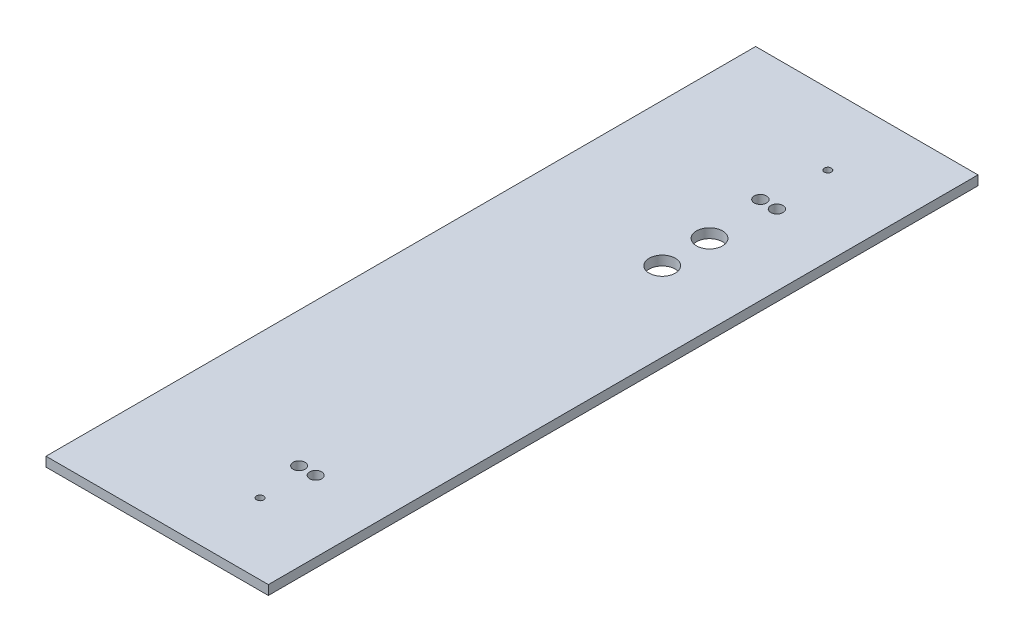
ISO-10303-21;
HEADER;
FILE_DESCRIPTION(('STEP AP214'),'2;1');
FILE_NAME('part.step','',(''),(''),'','','');
FILE_SCHEMA(('AUTOMOTIVE_DESIGN { 1 0 10303 214 1 1 1 1 }'));
ENDSEC;
DATA;
#1=APPLICATION_CONTEXT('core data for automotive mechanical design processes');
#2=APPLICATION_PROTOCOL_DEFINITION('international standard','automotive_design',2000,#1);
#3=PRODUCT_CONTEXT('',#1,'mechanical');
#4=PRODUCT('Part','Part','',(#3));
#5=PRODUCT_RELATED_PRODUCT_CATEGORY('part','',(#4));
#6=PRODUCT_DEFINITION_FORMATION('','',#4);
#7=PRODUCT_DEFINITION_CONTEXT('part definition',#1,'design');
#8=PRODUCT_DEFINITION('design','',#6,#7);
#9=PRODUCT_DEFINITION_SHAPE('','',#8);
#10=(LENGTH_UNIT() NAMED_UNIT(*) SI_UNIT(.MILLI.,.METRE.));
#11=(NAMED_UNIT(*) PLANE_ANGLE_UNIT() SI_UNIT($,.RADIAN.));
#12=(NAMED_UNIT(*) SI_UNIT($,.STERADIAN.) SOLID_ANGLE_UNIT());
#13=UNCERTAINTY_MEASURE_WITH_UNIT(LENGTH_MEASURE(1.E-05),#10,'distance_accuracy_value','');
#14=(GEOMETRIC_REPRESENTATION_CONTEXT(3) GLOBAL_UNCERTAINTY_ASSIGNED_CONTEXT((#13)) GLOBAL_UNIT_ASSIGNED_CONTEXT((#10,
#11,#12)) REPRESENTATION_CONTEXT('',''));
#15=CARTESIAN_POINT('',(0.,0.,0.));
#16=DIRECTION('',(0.,0.,1.));
#17=DIRECTION('',(1.,0.,0.));
#18=AXIS2_PLACEMENT_3D('',#15,#16,#17);
#19=CARTESIAN_POINT('',(0.,8.,0.));
#20=DIRECTION('',(1.,0.,0.));
#21=DIRECTION('',(0.,0.,-1.));
#22=AXIS2_PLACEMENT_3D('',#19,#20,#21);
#23=PLANE('',#22);
#24=DIRECTION('',(0.,0.,1.));
#25=VECTOR('',#24,1.);
#26=CARTESIAN_POINT('',(0.,0.,0.));
#27=LINE('',#26,#25);
#28=CARTESIAN_POINT('',(0.,0.,-600.));
#29=VERTEX_POINT('',#28);
#30=CARTESIAN_POINT('',(0.,0.,0.));
#31=VERTEX_POINT('',#30);
#32=EDGE_CURVE('E106',#29,#31,#27,.T.);
#33=ORIENTED_EDGE('',*,*,#32,.T.);
#34=DIRECTION('',(0.,-1.,0.));
#35=VECTOR('',#34,1.);
#36=CARTESIAN_POINT('',(0.,8.,0.));
#37=LINE('',#36,#35);
#38=CARTESIAN_POINT('',(0.,8.,0.));
#39=VERTEX_POINT('',#38);
#40=EDGE_CURVE('E11',#39,#31,#37,.T.);
#41=ORIENTED_EDGE('',*,*,#40,.F.);
#42=DIRECTION('',(0.,0.,1.));
#43=VECTOR('',#42,1.);
#44=CARTESIAN_POINT('',(0.,8.,0.));
#45=LINE('',#44,#43);
#46=CARTESIAN_POINT('',(0.,8.,-600.));
#47=VERTEX_POINT('',#46);
#48=EDGE_CURVE('E90',#47,#39,#45,.T.);
#49=ORIENTED_EDGE('',*,*,#48,.F.);
#50=DIRECTION('',(0.,-1.,0.));
#51=VECTOR('',#50,1.);
#52=CARTESIAN_POINT('',(0.,8.,-600.));
#53=LINE('',#52,#51);
#54=EDGE_CURVE('E102',#47,#29,#53,.T.);
#55=ORIENTED_EDGE('',*,*,#54,.T.);
#56=EDGE_LOOP('',(#33,#41,#49,#55));
#57=FACE_BOUND('',#56,.T.);
#58=ADVANCED_FACE('F38',(#57),#23,.F.);
#59=CARTESIAN_POINT('',(0.,8.,0.));
#60=DIRECTION('',(0.,0.,-1.));
#61=DIRECTION('',(-1.,0.,0.));
#62=AXIS2_PLACEMENT_3D('',#59,#60,#61);
#63=PLANE('',#62);
#64=DIRECTION('',(1.,0.,0.));
#65=VECTOR('',#64,1.);
#66=CARTESIAN_POINT('',(0.,0.,0.));
#67=LINE('',#66,#65);
#68=CARTESIAN_POINT('',(188.,0.,0.));
#69=VERTEX_POINT('',#68);
#70=EDGE_CURVE('E95',#31,#69,#67,.T.);
#71=ORIENTED_EDGE('',*,*,#70,.T.);
#72=DIRECTION('',(0.,-1.,0.));
#73=VECTOR('',#72,1.);
#74=CARTESIAN_POINT('',(188.,8.,0.));
#75=LINE('',#74,#73);
#76=CARTESIAN_POINT('',(188.,8.,0.));
#77=VERTEX_POINT('',#76);
#78=EDGE_CURVE('E47',#77,#69,#75,.T.);
#79=ORIENTED_EDGE('',*,*,#78,.F.);
#80=DIRECTION('',(1.,0.,0.));
#81=VECTOR('',#80,1.);
#82=CARTESIAN_POINT('',(0.,8.,0.));
#83=LINE('',#82,#81);
#84=EDGE_CURVE('E85',#39,#77,#83,.T.);
#85=ORIENTED_EDGE('',*,*,#84,.F.);
#86=ORIENTED_EDGE('',*,*,#40,.T.);
#87=EDGE_LOOP('',(#71,#79,#85,#86));
#88=FACE_BOUND('',#87,.T.);
#89=ADVANCED_FACE('F94',(#88),#63,.F.);
#90=CARTESIAN_POINT('',(188.,8.,0.));
#91=DIRECTION('',(-1.,0.,0.));
#92=DIRECTION('',(0.,0.,1.));
#93=AXIS2_PLACEMENT_3D('',#90,#91,#92);
#94=PLANE('',#93);
#95=DIRECTION('',(0.,0.,-1.));
#96=VECTOR('',#95,1.);
#97=CARTESIAN_POINT('',(188.,0.,0.));
#98=LINE('',#97,#96);
#99=CARTESIAN_POINT('',(188.,0.,-600.));
#100=VERTEX_POINT('',#99);
#101=EDGE_CURVE('E72',#69,#100,#98,.T.);
#102=ORIENTED_EDGE('',*,*,#101,.T.);
#103=DIRECTION('',(0.,-1.,0.));
#104=VECTOR('',#103,1.);
#105=CARTESIAN_POINT('',(188.,8.,-600.));
#106=LINE('',#105,#104);
#107=CARTESIAN_POINT('',(188.,8.,-600.));
#108=VERTEX_POINT('',#107);
#109=EDGE_CURVE('E97',#108,#100,#106,.T.);
#110=ORIENTED_EDGE('',*,*,#109,.F.);
#111=DIRECTION('',(0.,0.,-1.));
#112=VECTOR('',#111,1.);
#113=CARTESIAN_POINT('',(188.,8.,0.));
#114=LINE('',#113,#112);
#115=EDGE_CURVE('E88',#77,#108,#114,.T.);
#116=ORIENTED_EDGE('',*,*,#115,.F.);
#117=ORIENTED_EDGE('',*,*,#78,.T.);
#118=EDGE_LOOP('',(#102,#110,#116,#117));
#119=FACE_BOUND('',#118,.T.);
#120=ADVANCED_FACE('F98',(#119),#94,.F.);
#121=CARTESIAN_POINT('',(0.,8.,-600.));
#122=DIRECTION('',(0.,0.,1.));
#123=DIRECTION('',(1.,0.,0.));
#124=AXIS2_PLACEMENT_3D('',#121,#122,#123);
#125=PLANE('',#124);
#126=DIRECTION('',(-1.,0.,0.));
#127=VECTOR('',#126,1.);
#128=CARTESIAN_POINT('',(0.,0.,-600.));
#129=LINE('',#128,#127);
#130=EDGE_CURVE('E78',#100,#29,#129,.T.);
#131=ORIENTED_EDGE('',*,*,#130,.T.);
#132=ORIENTED_EDGE('',*,*,#54,.F.);
#133=DIRECTION('',(-1.,0.,0.));
#134=VECTOR('',#133,1.);
#135=CARTESIAN_POINT('',(0.,8.,-600.));
#136=LINE('',#135,#134);
#137=EDGE_CURVE('E55',#108,#47,#136,.T.);
#138=ORIENTED_EDGE('',*,*,#137,.F.);
#139=ORIENTED_EDGE('',*,*,#109,.T.);
#140=EDGE_LOOP('',(#131,#132,#138,#139));
#141=FACE_BOUND('',#140,.T.);
#142=ADVANCED_FACE('F120',(#141),#125,.F.);
#143=CARTESIAN_POINT('',(0.,8.,0.));
#144=DIRECTION('',(0.,-1.,0.));
#145=DIRECTION('',(0.,0.,-1.));
#146=AXIS2_PLACEMENT_3D('',#143,#144,#145);
#147=PLANE('',#146);
#148=CARTESIAN_POINT('',(121.,8.,-540.));
#149=DIRECTION('',(0.,1.,0.));
#150=DIRECTION('',(0.,0.,1.));
#151=AXIS2_PLACEMENT_3D('',#148,#149,#150);
#152=CIRCLE('',#151,2.99999999999999);
#153=CARTESIAN_POINT('',(121.,8.,-537.));
#154=VERTEX_POINT('',#153);
#155=EDGE_CURVE('E135',#154,#154,#152,.T.);
#156=ORIENTED_EDGE('',*,*,#155,.F.);
#157=EDGE_LOOP('',(#156));
#158=FACE_BOUND('',#157,.T.);
#159=CARTESIAN_POINT('',(128.,8.,-490.));
#160=DIRECTION('',(0.,1.,0.));
#161=DIRECTION('',(0.,0.,1.));
#162=AXIS2_PLACEMENT_3D('',#159,#160,#161);
#163=CIRCLE('',#162,5.2);
#164=CARTESIAN_POINT('',(128.,8.,-484.8));
#165=VERTEX_POINT('',#164);
#166=EDGE_CURVE('E143',#165,#165,#163,.T.);
#167=ORIENTED_EDGE('',*,*,#166,.F.);
#168=EDGE_LOOP('',(#167));
#169=FACE_BOUND('',#168,.T.);
#170=CARTESIAN_POINT('',(114.,8.,-490.));
#171=DIRECTION('',(0.,1.,0.));
#172=DIRECTION('',(0.,0.,1.));
#173=AXIS2_PLACEMENT_3D('',#170,#171,#172);
#174=CIRCLE('',#173,5.19999999999995);
#175=CARTESIAN_POINT('',(114.,8.,-484.8));
#176=VERTEX_POINT('',#175);
#177=EDGE_CURVE('E151',#176,#176,#174,.T.);
#178=ORIENTED_EDGE('',*,*,#177,.F.);
#179=EDGE_LOOP('',(#178));
#180=FACE_BOUND('',#179,.T.);
#181=CARTESIAN_POINT('',(121.,8.,-440.));
#182=DIRECTION('',(0.,1.,0.));
#183=DIRECTION('',(0.,0.,1.));
#184=AXIS2_PLACEMENT_3D('',#181,#182,#183);
#185=CIRCLE('',#184,11.);
#186=CARTESIAN_POINT('',(121.,8.,-429.));
#187=VERTEX_POINT('',#186);
#188=EDGE_CURVE('E159',#187,#187,#185,.T.);
#189=ORIENTED_EDGE('',*,*,#188,.F.);
#190=EDGE_LOOP('',(#189));
#191=FACE_BOUND('',#190,.T.);
#192=CARTESIAN_POINT('',(121.,8.,-400.));
#193=DIRECTION('',(0.,1.,0.));
#194=DIRECTION('',(0.,0.,1.));
#195=AXIS2_PLACEMENT_3D('',#192,#193,#194);
#196=CIRCLE('',#195,11.);
#197=CARTESIAN_POINT('',(121.,8.,-389.));
#198=VERTEX_POINT('',#197);
#199=EDGE_CURVE('E167',#198,#198,#196,.T.);
#200=ORIENTED_EDGE('',*,*,#199,.F.);
#201=EDGE_LOOP('',(#200));
#202=FACE_BOUND('',#201,.T.);
#203=CARTESIAN_POINT('',(121.,8.,-60.));
#204=DIRECTION('',(0.,1.,0.));
#205=DIRECTION('',(0.,0.,1.));
#206=AXIS2_PLACEMENT_3D('',#203,#204,#205);
#207=CIRCLE('',#206,3.00000000000001);
#208=CARTESIAN_POINT('',(121.,8.,-57.));
#209=VERTEX_POINT('',#208);
#210=EDGE_CURVE('E175',#209,#209,#207,.T.);
#211=ORIENTED_EDGE('',*,*,#210,.F.);
#212=EDGE_LOOP('',(#211));
#213=FACE_BOUND('',#212,.T.);
#214=CARTESIAN_POINT('',(128.,8.,-100.));
#215=DIRECTION('',(0.,1.,0.));
#216=DIRECTION('',(0.,0.,1.));
#217=AXIS2_PLACEMENT_3D('',#214,#215,#216);
#218=CIRCLE('',#217,5.09999999999998);
#219=CARTESIAN_POINT('',(128.,8.,-94.9));
#220=VERTEX_POINT('',#219);
#221=EDGE_CURVE('E183',#220,#220,#218,.T.);
#222=ORIENTED_EDGE('',*,*,#221,.F.);
#223=EDGE_LOOP('',(#222));
#224=FACE_BOUND('',#223,.T.);
#225=CARTESIAN_POINT('',(114.,8.,-100.));
#226=DIRECTION('',(0.,1.,0.));
#227=DIRECTION('',(0.,0.,1.));
#228=AXIS2_PLACEMENT_3D('',#225,#226,#227);
#229=CIRCLE('',#228,5.09999999999998);
#230=CARTESIAN_POINT('',(114.,8.,-94.9));
#231=VERTEX_POINT('',#230);
#232=EDGE_CURVE('E127',#231,#231,#229,.T.);
#233=ORIENTED_EDGE('',*,*,#232,.F.);
#234=EDGE_LOOP('',(#233));
#235=FACE_BOUND('',#234,.T.);
#236=ORIENTED_EDGE('',*,*,#48,.T.);
#237=ORIENTED_EDGE('',*,*,#84,.T.);
#238=ORIENTED_EDGE('',*,*,#115,.T.);
#239=ORIENTED_EDGE('',*,*,#137,.T.);
#240=EDGE_LOOP('',(#236,#237,#238,#239));
#241=FACE_BOUND('',#240,.T.);
#242=ADVANCED_FACE('F86',(#158,#169,#180,#191,#202,#213,#224,#235,#241),#147,.F.);
#243=CARTESIAN_POINT('',(0.,0.,0.));
#244=DIRECTION('',(0.,-1.,0.));
#245=DIRECTION('',(0.,0.,-1.));
#246=AXIS2_PLACEMENT_3D('',#243,#244,#245);
#247=PLANE('',#246);
#248=CARTESIAN_POINT('',(121.,0.,-540.));
#249=DIRECTION('',(0.,1.,0.));
#250=DIRECTION('',(0.,0.,1.));
#251=AXIS2_PLACEMENT_3D('',#248,#249,#250);
#252=CIRCLE('',#251,2.99999999999999);
#253=CARTESIAN_POINT('',(121.,0.,-537.));
#254=VERTEX_POINT('',#253);
#255=EDGE_CURVE('E139',#254,#254,#252,.T.);
#256=ORIENTED_EDGE('',*,*,#255,.T.);
#257=EDGE_LOOP('',(#256));
#258=FACE_BOUND('',#257,.T.);
#259=CARTESIAN_POINT('',(128.,0.,-490.));
#260=DIRECTION('',(0.,1.,0.));
#261=DIRECTION('',(0.,0.,1.));
#262=AXIS2_PLACEMENT_3D('',#259,#260,#261);
#263=CIRCLE('',#262,5.2);
#264=CARTESIAN_POINT('',(128.,0.,-484.8));
#265=VERTEX_POINT('',#264);
#266=EDGE_CURVE('E147',#265,#265,#263,.T.);
#267=ORIENTED_EDGE('',*,*,#266,.T.);
#268=EDGE_LOOP('',(#267));
#269=FACE_BOUND('',#268,.T.);
#270=CARTESIAN_POINT('',(114.,0.,-490.));
#271=DIRECTION('',(0.,1.,0.));
#272=DIRECTION('',(0.,0.,1.));
#273=AXIS2_PLACEMENT_3D('',#270,#271,#272);
#274=CIRCLE('',#273,5.19999999999995);
#275=CARTESIAN_POINT('',(114.,0.,-484.8));
#276=VERTEX_POINT('',#275);
#277=EDGE_CURVE('E155',#276,#276,#274,.T.);
#278=ORIENTED_EDGE('',*,*,#277,.T.);
#279=EDGE_LOOP('',(#278));
#280=FACE_BOUND('',#279,.T.);
#281=CARTESIAN_POINT('',(121.,0.,-440.));
#282=DIRECTION('',(0.,1.,0.));
#283=DIRECTION('',(0.,0.,1.));
#284=AXIS2_PLACEMENT_3D('',#281,#282,#283);
#285=CIRCLE('',#284,11.);
#286=CARTESIAN_POINT('',(121.,0.,-429.));
#287=VERTEX_POINT('',#286);
#288=EDGE_CURVE('E163',#287,#287,#285,.T.);
#289=ORIENTED_EDGE('',*,*,#288,.T.);
#290=EDGE_LOOP('',(#289));
#291=FACE_BOUND('',#290,.T.);
#292=CARTESIAN_POINT('',(121.,0.,-400.));
#293=DIRECTION('',(0.,1.,0.));
#294=DIRECTION('',(0.,0.,1.));
#295=AXIS2_PLACEMENT_3D('',#292,#293,#294);
#296=CIRCLE('',#295,11.);
#297=CARTESIAN_POINT('',(121.,0.,-389.));
#298=VERTEX_POINT('',#297);
#299=EDGE_CURVE('E171',#298,#298,#296,.T.);
#300=ORIENTED_EDGE('',*,*,#299,.T.);
#301=EDGE_LOOP('',(#300));
#302=FACE_BOUND('',#301,.T.);
#303=CARTESIAN_POINT('',(121.,0.,-60.));
#304=DIRECTION('',(0.,1.,0.));
#305=DIRECTION('',(0.,0.,1.));
#306=AXIS2_PLACEMENT_3D('',#303,#304,#305);
#307=CIRCLE('',#306,3.00000000000001);
#308=CARTESIAN_POINT('',(121.,0.,-57.));
#309=VERTEX_POINT('',#308);
#310=EDGE_CURVE('E179',#309,#309,#307,.T.);
#311=ORIENTED_EDGE('',*,*,#310,.T.);
#312=EDGE_LOOP('',(#311));
#313=FACE_BOUND('',#312,.T.);
#314=CARTESIAN_POINT('',(128.,0.,-100.));
#315=DIRECTION('',(0.,1.,0.));
#316=DIRECTION('',(0.,0.,1.));
#317=AXIS2_PLACEMENT_3D('',#314,#315,#316);
#318=CIRCLE('',#317,5.09999999999998);
#319=CARTESIAN_POINT('',(128.,0.,-94.9));
#320=VERTEX_POINT('',#319);
#321=EDGE_CURVE('E131',#320,#320,#318,.T.);
#322=ORIENTED_EDGE('',*,*,#321,.T.);
#323=EDGE_LOOP('',(#322));
#324=FACE_BOUND('',#323,.T.);
#325=CARTESIAN_POINT('',(114.,0.,-100.));
#326=DIRECTION('',(0.,1.,0.));
#327=DIRECTION('',(0.,0.,1.));
#328=AXIS2_PLACEMENT_3D('',#325,#326,#327);
#329=CIRCLE('',#328,5.09999999999998);
#330=CARTESIAN_POINT('',(114.,0.,-94.9));
#331=VERTEX_POINT('',#330);
#332=EDGE_CURVE('E110',#331,#331,#329,.T.);
#333=ORIENTED_EDGE('',*,*,#332,.T.);
#334=EDGE_LOOP('',(#333));
#335=FACE_BOUND('',#334,.T.);
#336=ORIENTED_EDGE('',*,*,#32,.F.);
#337=ORIENTED_EDGE('',*,*,#130,.F.);
#338=ORIENTED_EDGE('',*,*,#101,.F.);
#339=ORIENTED_EDGE('',*,*,#70,.F.);
#340=EDGE_LOOP('',(#336,#337,#338,#339));
#341=FACE_BOUND('',#340,.T.);
#342=ADVANCED_FACE('F123',(#258,#269,#280,#291,#302,#313,#324,#335,#341),#247,.T.);
#343=CARTESIAN_POINT('',(114.,0.,-100.));
#344=DIRECTION('',(0.,1.,0.));
#345=DIRECTION('',(0.,0.,1.));
#346=AXIS2_PLACEMENT_3D('',#343,#344,#345);
#347=CYLINDRICAL_SURFACE('',#346,5.09999999999998);
#348=ORIENTED_EDGE('',*,*,#332,.F.);
#349=EDGE_LOOP('',(#348));
#350=FACE_BOUND('',#349,.T.);
#351=ORIENTED_EDGE('',*,*,#232,.T.);
#352=EDGE_LOOP('',(#351));
#353=FACE_BOUND('',#352,.T.);
#354=ADVANCED_FACE('F197',(#350,#353),#347,.F.);
#355=CARTESIAN_POINT('',(128.,0.,-100.));
#356=DIRECTION('',(0.,1.,0.));
#357=DIRECTION('',(0.,0.,1.));
#358=AXIS2_PLACEMENT_3D('',#355,#356,#357);
#359=CYLINDRICAL_SURFACE('',#358,5.09999999999998);
#360=ORIENTED_EDGE('',*,*,#321,.F.);
#361=EDGE_LOOP('',(#360));
#362=FACE_BOUND('',#361,.T.);
#363=ORIENTED_EDGE('',*,*,#221,.T.);
#364=EDGE_LOOP('',(#363));
#365=FACE_BOUND('',#364,.T.);
#366=ADVANCED_FACE('F193',(#362,#365),#359,.F.);
#367=CARTESIAN_POINT('',(121.,0.,-60.));
#368=DIRECTION('',(0.,1.,0.));
#369=DIRECTION('',(0.,0.,1.));
#370=AXIS2_PLACEMENT_3D('',#367,#368,#369);
#371=CYLINDRICAL_SURFACE('',#370,3.00000000000001);
#372=ORIENTED_EDGE('',*,*,#310,.F.);
#373=EDGE_LOOP('',(#372));
#374=FACE_BOUND('',#373,.T.);
#375=ORIENTED_EDGE('',*,*,#210,.T.);
#376=EDGE_LOOP('',(#375));
#377=FACE_BOUND('',#376,.T.);
#378=ADVANCED_FACE('F196',(#374,#377),#371,.F.);
#379=CARTESIAN_POINT('',(121.,0.,-400.));
#380=DIRECTION('',(0.,1.,0.));
#381=DIRECTION('',(0.,0.,1.));
#382=AXIS2_PLACEMENT_3D('',#379,#380,#381);
#383=CYLINDRICAL_SURFACE('',#382,11.);
#384=ORIENTED_EDGE('',*,*,#299,.F.);
#385=EDGE_LOOP('',(#384));
#386=FACE_BOUND('',#385,.T.);
#387=ORIENTED_EDGE('',*,*,#199,.T.);
#388=EDGE_LOOP('',(#387));
#389=FACE_BOUND('',#388,.T.);
#390=ADVANCED_FACE('F260',(#386,#389),#383,.F.);
#391=CARTESIAN_POINT('',(121.,0.,-440.));
#392=DIRECTION('',(0.,1.,0.));
#393=DIRECTION('',(0.,0.,1.));
#394=AXIS2_PLACEMENT_3D('',#391,#392,#393);
#395=CYLINDRICAL_SURFACE('',#394,11.);
#396=ORIENTED_EDGE('',*,*,#288,.F.);
#397=EDGE_LOOP('',(#396));
#398=FACE_BOUND('',#397,.T.);
#399=ORIENTED_EDGE('',*,*,#188,.T.);
#400=EDGE_LOOP('',(#399));
#401=FACE_BOUND('',#400,.T.);
#402=ADVANCED_FACE('F270',(#398,#401),#395,.F.);
#403=CARTESIAN_POINT('',(114.,0.,-490.));
#404=DIRECTION('',(0.,1.,0.));
#405=DIRECTION('',(0.,0.,1.));
#406=AXIS2_PLACEMENT_3D('',#403,#404,#405);
#407=CYLINDRICAL_SURFACE('',#406,5.19999999999995);
#408=ORIENTED_EDGE('',*,*,#277,.F.);
#409=EDGE_LOOP('',(#408));
#410=FACE_BOUND('',#409,.T.);
#411=ORIENTED_EDGE('',*,*,#177,.T.);
#412=EDGE_LOOP('',(#411));
#413=FACE_BOUND('',#412,.T.);
#414=ADVANCED_FACE('F280',(#410,#413),#407,.F.);
#415=CARTESIAN_POINT('',(128.,0.,-490.));
#416=DIRECTION('',(0.,1.,0.));
#417=DIRECTION('',(0.,0.,1.));
#418=AXIS2_PLACEMENT_3D('',#415,#416,#417);
#419=CYLINDRICAL_SURFACE('',#418,5.2);
#420=ORIENTED_EDGE('',*,*,#266,.F.);
#421=EDGE_LOOP('',(#420));
#422=FACE_BOUND('',#421,.T.);
#423=ORIENTED_EDGE('',*,*,#166,.T.);
#424=EDGE_LOOP('',(#423));
#425=FACE_BOUND('',#424,.T.);
#426=ADVANCED_FACE('F290',(#422,#425),#419,.F.);
#427=CARTESIAN_POINT('',(121.,0.,-540.));
#428=DIRECTION('',(0.,1.,0.));
#429=DIRECTION('',(0.,0.,1.));
#430=AXIS2_PLACEMENT_3D('',#427,#428,#429);
#431=CYLINDRICAL_SURFACE('',#430,2.99999999999999);
#432=ORIENTED_EDGE('',*,*,#255,.F.);
#433=EDGE_LOOP('',(#432));
#434=FACE_BOUND('',#433,.T.);
#435=ORIENTED_EDGE('',*,*,#155,.T.);
#436=EDGE_LOOP('',(#435));
#437=FACE_BOUND('',#436,.T.);
#438=ADVANCED_FACE('F300',(#434,#437),#431,.F.);
#439=CLOSED_SHELL('',(#58,#89,#120,#142,#242,#342,#354,#366,#378,#390,#402,#414,#426,#438));
#440=MANIFOLD_SOLID_BREP('B2',#439);
#441=ADVANCED_BREP_SHAPE_REPRESENTATION('',(#18,#440),#14);
#442=SHAPE_DEFINITION_REPRESENTATION(#9,#441);
ENDSEC;
END-ISO-10303-21;
